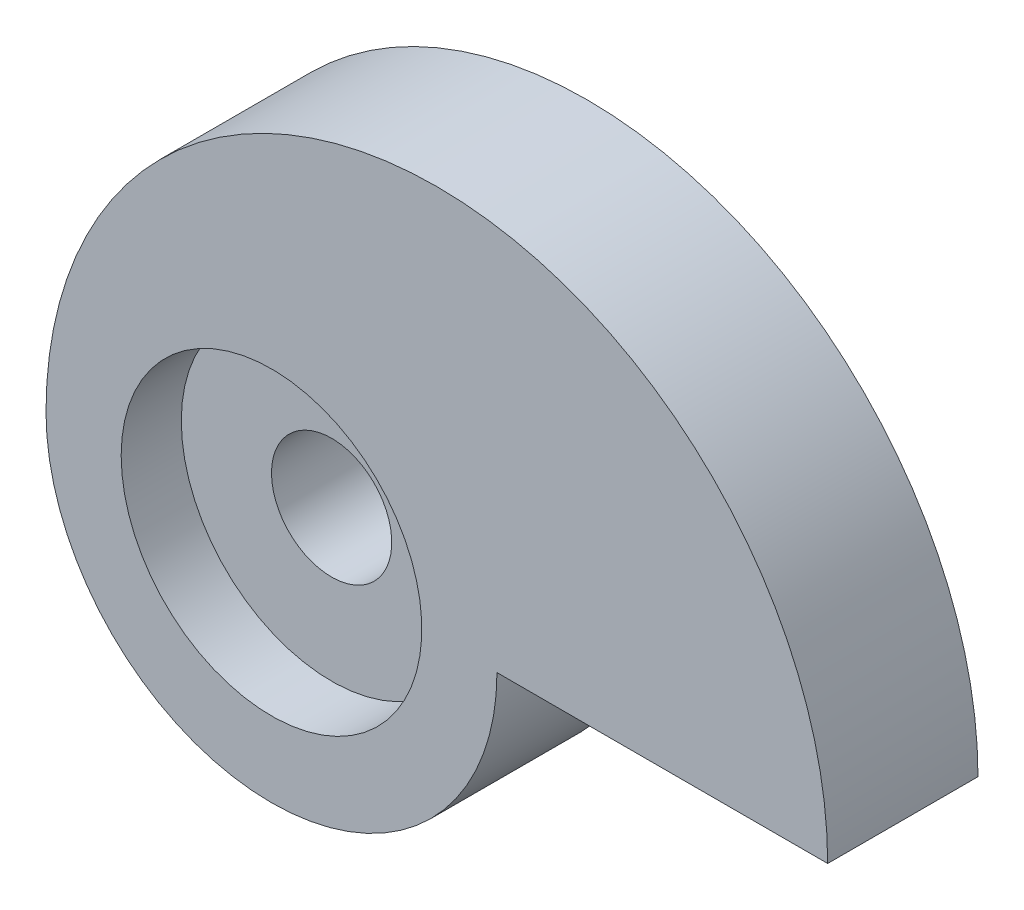
ISO-10303-21;
HEADER;
FILE_DESCRIPTION(('STEP AP214'),'2;1');
FILE_NAME('part.step','',(''),(''),'','','');
FILE_SCHEMA(('AUTOMOTIVE_DESIGN { 1 0 10303 214 1 1 1 1 }'));
ENDSEC;
DATA;
#1=APPLICATION_CONTEXT('core data for automotive mechanical design processes');
#2=APPLICATION_PROTOCOL_DEFINITION('international standard','automotive_design',2000,#1);
#3=PRODUCT_CONTEXT('',#1,'mechanical');
#4=PRODUCT('Part','Part','',(#3));
#5=PRODUCT_RELATED_PRODUCT_CATEGORY('part','',(#4));
#6=PRODUCT_DEFINITION_FORMATION('','',#4);
#7=PRODUCT_DEFINITION_CONTEXT('part definition',#1,'design');
#8=PRODUCT_DEFINITION('design','',#6,#7);
#9=PRODUCT_DEFINITION_SHAPE('','',#8);
#10=(LENGTH_UNIT() NAMED_UNIT(*) SI_UNIT(.MILLI.,.METRE.));
#11=(NAMED_UNIT(*) PLANE_ANGLE_UNIT() SI_UNIT($,.RADIAN.));
#12=(NAMED_UNIT(*) SI_UNIT($,.STERADIAN.) SOLID_ANGLE_UNIT());
#13=UNCERTAINTY_MEASURE_WITH_UNIT(LENGTH_MEASURE(1.E-05),#10,'distance_accuracy_value','');
#14=(GEOMETRIC_REPRESENTATION_CONTEXT(3) GLOBAL_UNCERTAINTY_ASSIGNED_CONTEXT((#13)) GLOBAL_UNIT_ASSIGNED_CONTEXT((#10,
#11,#12)) REPRESENTATION_CONTEXT('',''));
#15=CARTESIAN_POINT('',(0.,0.,0.));
#16=DIRECTION('',(0.,0.,1.));
#17=DIRECTION('',(1.,0.,0.));
#18=AXIS2_PLACEMENT_3D('',#15,#16,#17);
#19=CARTESIAN_POINT('',(-5.5,0.,-5.));
#20=DIRECTION('',(0.,0.,1.));
#21=DIRECTION('',(1.,0.,0.));
#22=AXIS2_PLACEMENT_3D('',#19,#20,#21);
#23=PLANE('',#22);
#24=CARTESIAN_POINT('',(-5.5,0.,-5.));
#25=DIRECTION('',(0.,0.,1.));
#26=DIRECTION('',(1.,0.,0.));
#27=AXIS2_PLACEMENT_3D('',#24,#25,#26);
#28=CIRCLE('',#27,5.);
#29=CARTESIAN_POINT('',(-10.3989794855664,-1.,-5.));
#30=VERTEX_POINT('',#29);
#31=CARTESIAN_POINT('',(-0.601020514433643,-1.,-5.));
#32=VERTEX_POINT('',#31);
#33=EDGE_CURVE('E407',#30,#32,#28,.T.);
#34=ORIENTED_EDGE('',*,*,#33,.F.);
#35=DIRECTION('',(1.,0.,0.));
#36=VECTOR('',#35,1.);
#37=CARTESIAN_POINT('',(-5.5,-1.,-5.));
#38=LINE('',#37,#36);
#39=CARTESIAN_POINT('',(-7.23205080756888,-1.,-5.));
#40=VERTEX_POINT('',#39);
#41=EDGE_CURVE('E443',#30,#40,#38,.T.);
#42=ORIENTED_EDGE('',*,*,#41,.T.);
#43=CARTESIAN_POINT('',(-5.5,0.,-5.));
#44=DIRECTION('',(0.,0.,1.));
#45=DIRECTION('',(1.,0.,0.));
#46=AXIS2_PLACEMENT_3D('',#43,#44,#45);
#47=CIRCLE('',#46,2.);
#48=CARTESIAN_POINT('',(-3.76794919243112,-1.,-5.));
#49=VERTEX_POINT('',#48);
#50=EDGE_CURVE('E408',#40,#49,#47,.T.);
#51=ORIENTED_EDGE('',*,*,#50,.T.);
#52=EDGE_CURVE('E440',#49,#32,#38,.T.);
#53=ORIENTED_EDGE('',*,*,#52,.T.);
#54=EDGE_LOOP('',(#34,#42,#51,#53));
#55=FACE_BOUND('',#54,.T.);
#56=ADVANCED_FACE('F286',(#55),#23,.F.);
#57=CARTESIAN_POINT('',(-5.5,0.,5.));
#58=DIRECTION('',(0.,0.,1.));
#59=DIRECTION('',(1.,0.,0.));
#60=AXIS2_PLACEMENT_3D('',#57,#58,#59);
#61=PLANE('',#60);
#62=CARTESIAN_POINT('',(-5.5,0.,5.));
#63=DIRECTION('',(0.,0.,-1.));
#64=DIRECTION('',(-1.,0.,0.));
#65=AXIS2_PLACEMENT_3D('',#62,#63,#64);
#66=CIRCLE('',#65,5.);
#67=CARTESIAN_POINT('',(-10.5,0.,5.));
#68=VERTEX_POINT('',#67);
#69=EDGE_CURVE('E594',#68,#68,#66,.T.);
#70=ORIENTED_EDGE('',*,*,#69,.T.);
#71=EDGE_LOOP('',(#70));
#72=FACE_BOUND('',#71,.T.);
#73=CARTESIAN_POINT('',(-5.5,0.,5.));
#74=DIRECTION('',(0.,0.,1.));
#75=DIRECTION('',(1.,0.,0.));
#76=AXIS2_PLACEMENT_3D('',#73,#74,#75);
#77=CIRCLE('',#76,7.5);
#78=CARTESIAN_POINT('',(-13.,0.,5.));
#79=VERTEX_POINT('',#78);
#80=CARTESIAN_POINT('',(2.,0.,5.));
#81=VERTEX_POINT('',#80);
#82=EDGE_CURVE('E419',#79,#81,#77,.T.);
#83=ORIENTED_EDGE('',*,*,#82,.T.);
#84=DIRECTION('',(1.,0.,0.));
#85=VECTOR('',#84,1.);
#86=CARTESIAN_POINT('',(2.,0.,5.));
#87=LINE('',#86,#85);
#88=CARTESIAN_POINT('',(13.,0.,5.));
#89=VERTEX_POINT('',#88);
#90=EDGE_CURVE('E422',#81,#89,#87,.T.);
#91=ORIENTED_EDGE('',*,*,#90,.T.);
#92=CARTESIAN_POINT('',(0.,0.,5.));
#93=DIRECTION('',(0.,0.,1.));
#94=DIRECTION('',(1.,0.,0.));
#95=AXIS2_PLACEMENT_3D('',#92,#93,#94);
#96=CIRCLE('',#95,13.);
#97=EDGE_CURVE('E425',#89,#79,#96,.T.);
#98=ORIENTED_EDGE('',*,*,#97,.T.);
#99=EDGE_LOOP('',(#83,#91,#98));
#100=FACE_BOUND('',#99,.T.);
#101=ADVANCED_FACE('F479',(#72,#100),#61,.T.);
#102=CARTESIAN_POINT('',(-5.5,0.,0.));
#103=DIRECTION('',(0.,0.,1.));
#104=DIRECTION('',(1.,0.,0.));
#105=AXIS2_PLACEMENT_3D('',#102,#103,#104);
#106=PLANE('',#105);
#107=CARTESIAN_POINT('',(-5.5,0.,0.));
#108=DIRECTION('',(0.,0.,1.));
#109=DIRECTION('',(1.,0.,0.));
#110=AXIS2_PLACEMENT_3D('',#107,#108,#109);
#111=CIRCLE('',#110,6.5);
#112=CARTESIAN_POINT('',(1.,0.,0.));
#113=VERTEX_POINT('',#112);
#114=EDGE_CURVE('E294',#113,#113,#111,.T.);
#115=ORIENTED_EDGE('',*,*,#114,.T.);
#116=EDGE_LOOP('',(#115));
#117=FACE_BOUND('',#116,.T.);
#118=CARTESIAN_POINT('',(-5.5,0.,0.));
#119=DIRECTION('',(0.,0.,1.));
#120=DIRECTION('',(1.,0.,0.));
#121=AXIS2_PLACEMENT_3D('',#118,#119,#120);
#122=CIRCLE('',#121,7.5);
#123=CARTESIAN_POINT('',(-13.,0.,0.));
#124=VERTEX_POINT('',#123);
#125=CARTESIAN_POINT('',(2.,0.,0.));
#126=VERTEX_POINT('',#125);
#127=EDGE_CURVE('E418',#124,#126,#122,.T.);
#128=ORIENTED_EDGE('',*,*,#127,.F.);
#129=CARTESIAN_POINT('',(0.,0.,0.));
#130=DIRECTION('',(0.,0.,1.));
#131=DIRECTION('',(1.,0.,0.));
#132=AXIS2_PLACEMENT_3D('',#129,#130,#131);
#133=CIRCLE('',#132,13.);
#134=CARTESIAN_POINT('',(13.,0.,0.));
#135=VERTEX_POINT('',#134);
#136=EDGE_CURVE('E423',#135,#124,#133,.T.);
#137=ORIENTED_EDGE('',*,*,#136,.F.);
#138=DIRECTION('',(1.,0.,0.));
#139=VECTOR('',#138,1.);
#140=CARTESIAN_POINT('',(2.,0.,0.));
#141=LINE('',#140,#139);
#142=EDGE_CURVE('E430',#126,#135,#141,.T.);
#143=ORIENTED_EDGE('',*,*,#142,.F.);
#144=EDGE_LOOP('',(#128,#137,#143));
#145=FACE_BOUND('',#144,.T.);
#146=ADVANCED_FACE('F540',(#117,#145),#106,.F.);
#147=CARTESIAN_POINT('',(-5.5,0.,5.));
#148=DIRECTION('',(0.,0.,-1.));
#149=DIRECTION('',(-1.,0.,0.));
#150=AXIS2_PLACEMENT_3D('',#147,#148,#149);
#151=CYLINDRICAL_SURFACE('',#150,7.5);
#152=ORIENTED_EDGE('',*,*,#127,.T.);
#153=DIRECTION('',(0.,0.,-1.));
#154=VECTOR('',#153,1.);
#155=CARTESIAN_POINT('',(2.,0.,5.));
#156=LINE('',#155,#154);
#157=EDGE_CURVE('E395',#81,#126,#156,.T.);
#158=ORIENTED_EDGE('',*,*,#157,.F.);
#159=ORIENTED_EDGE('',*,*,#82,.F.);
#160=DIRECTION('',(0.,0.,-1.));
#161=VECTOR('',#160,1.);
#162=CARTESIAN_POINT('',(-13.,0.,5.));
#163=LINE('',#162,#161);
#164=EDGE_CURVE('E427',#79,#124,#163,.T.);
#165=ORIENTED_EDGE('',*,*,#164,.T.);
#166=EDGE_LOOP('',(#152,#158,#159,#165));
#167=FACE_BOUND('',#166,.T.);
#168=ADVANCED_FACE('F612',(#167),#151,.T.);
#169=CARTESIAN_POINT('',(2.,0.,5.));
#170=DIRECTION('',(0.,1.,0.));
#171=DIRECTION('',(0.,0.,1.));
#172=AXIS2_PLACEMENT_3D('',#169,#170,#171);
#173=PLANE('',#172);
#174=ORIENTED_EDGE('',*,*,#142,.T.);
#175=DIRECTION('',(0.,0.,-1.));
#176=VECTOR('',#175,1.);
#177=CARTESIAN_POINT('',(13.,0.,5.));
#178=LINE('',#177,#176);
#179=EDGE_CURVE('E435',#89,#135,#178,.T.);
#180=ORIENTED_EDGE('',*,*,#179,.F.);
#181=ORIENTED_EDGE('',*,*,#90,.F.);
#182=ORIENTED_EDGE('',*,*,#157,.T.);
#183=EDGE_LOOP('',(#174,#180,#181,#182));
#184=FACE_BOUND('',#183,.T.);
#185=ADVANCED_FACE('F615',(#184),#173,.F.);
#186=CARTESIAN_POINT('',(0.,0.,5.));
#187=DIRECTION('',(0.,0.,-1.));
#188=DIRECTION('',(-1.,0.,0.));
#189=AXIS2_PLACEMENT_3D('',#186,#187,#188);
#190=CYLINDRICAL_SURFACE('',#189,13.);
#191=ORIENTED_EDGE('',*,*,#136,.T.);
#192=ORIENTED_EDGE('',*,*,#164,.F.);
#193=ORIENTED_EDGE('',*,*,#97,.F.);
#194=ORIENTED_EDGE('',*,*,#179,.T.);
#195=EDGE_LOOP('',(#191,#192,#193,#194));
#196=FACE_BOUND('',#195,.T.);
#197=ADVANCED_FACE('F475',(#196),#190,.T.);
#198=CARTESIAN_POINT('',(-5.5,0.,5.));
#199=DIRECTION('',(0.,0.,-1.));
#200=DIRECTION('',(-1.,0.,0.));
#201=AXIS2_PLACEMENT_3D('',#198,#199,#200);
#202=CYLINDRICAL_SURFACE('',#201,2.);
#203=CARTESIAN_POINT('',(-5.5,0.,3.));
#204=DIRECTION('',(0.,0.,-1.));
#205=DIRECTION('',(-1.,0.,0.));
#206=AXIS2_PLACEMENT_3D('',#203,#204,#205);
#207=CIRCLE('',#206,2.);
#208=CARTESIAN_POINT('',(-7.5,0.,3.));
#209=VERTEX_POINT('',#208);
#210=EDGE_CURVE('E534',#209,#209,#207,.T.);
#211=ORIENTED_EDGE('',*,*,#210,.F.);
#212=EDGE_LOOP('',(#211));
#213=FACE_BOUND('',#212,.T.);
#214=DIRECTION('',(0.,0.,-1.));
#215=VECTOR('',#214,1.);
#216=CARTESIAN_POINT('',(-7.23205080756888,-1.,5.));
#217=LINE('',#216,#215);
#218=CARTESIAN_POINT('',(-7.23205080756888,-1.,-3.));
#219=VERTEX_POINT('',#218);
#220=EDGE_CURVE('E414',#219,#40,#217,.T.);
#221=ORIENTED_EDGE('',*,*,#220,.F.);
#222=CARTESIAN_POINT('',(-7.23205080756888,-1.,-3.));
#223=CARTESIAN_POINT('',(-7.23204560573923,-1.00000195095149,-2.97380285641391));
#224=CARTESIAN_POINT('',(-7.2326458858948,-0.998969898721332,-2.94762059770534));
#225=CARTESIAN_POINT('',(-7.23500691100267,-0.994866625374567,-2.89548480130888));
#226=CARTESIAN_POINT('',(-7.23676694275608,-0.991796657482529,-2.86953113298121));
#227=CARTESIAN_POINT('',(-7.24368127709527,-0.979625521569913,-2.79260627254522));
#228=CARTESIAN_POINT('',(-7.25047118365239,-0.967562217088458,-2.74221712497417));
#229=CARTESIAN_POINT('',(-7.26748620757471,-0.936112076930328,-2.64457478379179));
#230=CARTESIAN_POINT('',(-7.27770440777793,-0.916739978258813,-2.59731550323605));
#231=CARTESIAN_POINT('',(-7.30040752413289,-0.871307839950419,-2.50664598928886));
#232=CARTESIAN_POINT('',(-7.31289603769649,-0.845237158617568,-2.46324202967145));
#233=CARTESIAN_POINT('',(-7.33996996559499,-0.78466357692548,-2.37768910292446));
#234=CARTESIAN_POINT('',(-7.35464333980743,-0.749645593111382,-2.33593276583788));
#235=CARTESIAN_POINT('',(-7.38372264002614,-0.673245759307682,-2.25858503946699));
#236=CARTESIAN_POINT('',(-7.39812848227474,-0.631861952761062,-2.22299555276055));
#237=CARTESIAN_POINT('',(-7.42622118410519,-0.540468641751175,-2.15661730434459));
#238=CARTESIAN_POINT('',(-7.43979253814581,-0.49006394619474,-2.12631956530011));
#239=CARTESIAN_POINT('',(-7.46351808066169,-0.384102077650395,-2.07483808826));
#240=CARTESIAN_POINT('',(-7.47367754829968,-0.328553035948645,-2.05364025583376));
#241=CARTESIAN_POINT('',(-7.48750807842346,-0.227502707957967,-2.02516217757423));
#242=CARTESIAN_POINT('',(-7.4921439649176,-0.182718319154595,-2.01577939701738));
#243=CARTESIAN_POINT('',(-7.49841285567472,-0.0919751083193857,-2.0031745104819));
#244=CARTESIAN_POINT('',(-7.50003827707627,-0.0460136154548431,-1.99996796059347));
#245=CARTESIAN_POINT('',(-7.5,0.,-2.));
#246=B_SPLINE_CURVE_WITH_KNOTS('',3,(#222,#223,#224,#225,#226,#227,#228,#229,#230,#231,#232,
#233,#234,#235,#236,#237,#238,#239,#240,#241,#242,#243,#244,#245),.UNSPECIFIED.,.F.,.F.,(4,2,2,
2,2,2,2,2,2,2,2,4),(0.,0.0785359204552875,0.157023589610273,0.312951876927789,0.46856742585974,
0.624431738505428,0.793037268766896,0.961694724432391,1.14182101966475,1.32166730997762,
1.45913325097171,1.59694497738737),.UNSPECIFIED.);
#247=CARTESIAN_POINT('',(-7.5,0.,-2.));
#248=VERTEX_POINT('',#247);
#249=EDGE_CURVE('E486',#219,#248,#246,.T.);
#250=ORIENTED_EDGE('',*,*,#249,.T.);
#251=CARTESIAN_POINT('',(-7.5,0.,-2.));
#252=CARTESIAN_POINT('',(-7.50000270001444,0.026406025225628,-1.99999859692792));
#253=CARTESIAN_POINT('',(-7.49947646417091,0.0527980136949361,-2.00104663431609));
#254=CARTESIAN_POINT('',(-7.49739531857115,0.105366311265512,-2.00521716287123));
#255=CARTESIAN_POINT('',(-7.49584082204084,0.131542702731886,-2.00833882071687));
#256=CARTESIAN_POINT('',(-7.48970044136635,0.209215974974574,-2.02073369494834));
#257=CARTESIAN_POINT('',(-7.48363700497133,0.260148469940141,-2.0330374412745));
#258=CARTESIAN_POINT('',(-7.46816731079717,0.358917466881668,-2.06518513879199));
#259=CARTESIAN_POINT('',(-7.45876478870542,0.406757358371933,-2.08502066532185));
#260=CARTESIAN_POINT('',(-7.43747068148192,0.498421727903021,-2.13154141113257));
#261=CARTESIAN_POINT('',(-7.42557658512388,0.5422420901472,-2.15823354729241));
#262=CARTESIAN_POINT('',(-7.39956294700834,0.627507636466253,-2.21951645733809));
#263=CARTESIAN_POINT('',(-7.38535278220365,0.668653367046101,-2.25448455863881));
#264=CARTESIAN_POINT('',(-7.35660030766928,0.744777592319192,-2.3305197075124));
#265=CARTESIAN_POINT('',(-7.34205773926212,0.779751085456756,-2.37159165202963));
#266=CARTESIAN_POINT('',(-7.31297902171833,0.845276230561724,-2.46251644312768));
#267=CARTESIAN_POINT('',(-7.29853253759958,0.875267218548396,-2.51280503036786));
#268=CARTESIAN_POINT('',(-7.27284187626178,0.926200179305586,-2.61845147831261));
#269=CARTESIAN_POINT('',(-7.26159085728834,0.947161535789092,-2.67379816793758));
#270=CARTESIAN_POINT('',(-7.2461767744272,0.97522726996317,-2.77427050838128));
#271=CARTESIAN_POINT('',(-7.24095909763356,0.984453466376408,-2.81864596282671));
#272=CARTESIAN_POINT('',(-7.23385952558355,0.99686812992437,-2.90865475887692));
#273=CARTESIAN_POINT('',(-7.23199004977433,1.00003412097476,-2.95429214871369));
#274=CARTESIAN_POINT('',(-7.23205080756888,1.,-3.));
#275=B_SPLINE_CURVE_WITH_KNOTS('',3,(#251,#252,#253,#254,#255,#256,#257,#258,#259,#260,#261,
#262,#263,#264,#265,#266,#267,#268,#269,#270,#271,#272,#273,#274),.UNSPECIFIED.,.F.,.F.,(4,2,2,
2,2,2,2,2,2,2,2,4),(0.,0.0791649034650184,0.158298012334672,0.315701755856429,0.472929951841001,
0.630317385234155,0.797131343834443,0.964079862432026,1.14410070601832,1.32373315332476,
1.4600864569716,1.59694449515729),.UNSPECIFIED.);
#276=CARTESIAN_POINT('',(-7.23205080756888,1.,-3.));
#277=VERTEX_POINT('',#276);
#278=EDGE_CURVE('E402',#248,#277,#275,.T.);
#279=ORIENTED_EDGE('',*,*,#278,.T.);
#280=DIRECTION('',(0.,0.,-1.));
#281=VECTOR('',#280,1.);
#282=CARTESIAN_POINT('',(-7.23205080756888,1.,5.));
#283=LINE('',#282,#281);
#284=CARTESIAN_POINT('',(-7.23205080756888,1.,-5.));
#285=VERTEX_POINT('',#284);
#286=EDGE_CURVE('E386',#285,#277,#283,.F.);
#287=ORIENTED_EDGE('',*,*,#286,.F.);
#288=CARTESIAN_POINT('',(-3.76794919243112,1.,-5.));
#289=VERTEX_POINT('',#288);
#290=EDGE_CURVE('E400',#289,#285,#47,.T.);
#291=ORIENTED_EDGE('',*,*,#290,.F.);
#292=DIRECTION('',(0.,0.,-1.));
#293=VECTOR('',#292,1.);
#294=CARTESIAN_POINT('',(-3.76794919243112,1.,5.));
#295=LINE('',#294,#293);
#296=CARTESIAN_POINT('',(-3.76794919243112,1.,-3.));
#297=VERTEX_POINT('',#296);
#298=EDGE_CURVE('E403',#297,#289,#295,.T.);
#299=ORIENTED_EDGE('',*,*,#298,.F.);
#300=CARTESIAN_POINT('',(-3.76794919243112,1.,-3.));
#301=CARTESIAN_POINT('',(-3.76795439426077,1.00000195095149,-2.97380285641391));
#302=CARTESIAN_POINT('',(-3.7673541141052,0.998969898721333,-2.94762059770534));
#303=CARTESIAN_POINT('',(-3.76499308899733,0.994866625374568,-2.89548480130888));
#304=CARTESIAN_POINT('',(-3.76323305724392,0.991796657482529,-2.86953113298121));
#305=CARTESIAN_POINT('',(-3.75631872290473,0.979625521569914,-2.79260627254522));
#306=CARTESIAN_POINT('',(-3.74952881634761,0.967562217088458,-2.74221712497417));
#307=CARTESIAN_POINT('',(-3.73251379242529,0.936112076930329,-2.64457478379179));
#308=CARTESIAN_POINT('',(-3.72229559222207,0.916739978258813,-2.59731550323605));
#309=CARTESIAN_POINT('',(-3.69959247586711,0.871307839950419,-2.50664598928886));
#310=CARTESIAN_POINT('',(-3.68710396230351,0.845237158617568,-2.46324202967145));
#311=CARTESIAN_POINT('',(-3.66003003440501,0.78466357692548,-2.37768910292446));
#312=CARTESIAN_POINT('',(-3.64535666019257,0.749645593111382,-2.33593276583788));
#313=CARTESIAN_POINT('',(-3.61627735997386,0.673245759307683,-2.25858503946699));
#314=CARTESIAN_POINT('',(-3.60187151772526,0.631861952761062,-2.22299555276055));
#315=CARTESIAN_POINT('',(-3.57377881589481,0.540468641751176,-2.15661730434459));
#316=CARTESIAN_POINT('',(-3.56020746185418,0.49006394619474,-2.12631956530011));
#317=CARTESIAN_POINT('',(-3.53648191933831,0.384102077650396,-2.07483808826));
#318=CARTESIAN_POINT('',(-3.52632245170032,0.328553035948646,-2.05364025583376));
#319=CARTESIAN_POINT('',(-3.51249192157654,0.227502707957968,-2.02516217757423));
#320=CARTESIAN_POINT('',(-3.5078560350824,0.182718319154596,-2.01577939701738));
#321=CARTESIAN_POINT('',(-3.50158714432528,0.0919751083193864,-2.0031745104819));
#322=CARTESIAN_POINT('',(-3.49996172292373,0.0460136154548437,-1.99996796059347));
#323=CARTESIAN_POINT('',(-3.5,0.,-2.));
#324=B_SPLINE_CURVE_WITH_KNOTS('',3,(#300,#301,#302,#303,#304,#305,#306,#307,#308,#309,#310,
#311,#312,#313,#314,#315,#316,#317,#318,#319,#320,#321,#322,#323),.UNSPECIFIED.,.F.,.F.,(4,2,2,
2,2,2,2,2,2,2,2,4),(0.,0.0785359204552875,0.157023589610273,0.312951876927789,0.46856742585974,
0.624431738505428,0.793037268766896,0.96169472443239,1.14182101966475,1.32166730997762,
1.45913325097171,1.59694497738737),.UNSPECIFIED.);
#325=CARTESIAN_POINT('',(-3.5,0.,-2.));
#326=VERTEX_POINT('',#325);
#327=EDGE_CURVE('E309',#297,#326,#324,.T.);
#328=ORIENTED_EDGE('',*,*,#327,.T.);
#329=CARTESIAN_POINT('',(-3.5,0.,-2.));
#330=CARTESIAN_POINT('',(-3.49999729998556,-0.0264060252256275,-1.99999859692792));
#331=CARTESIAN_POINT('',(-3.50052353582909,-0.0527980136949356,-2.00104663431609));
#332=CARTESIAN_POINT('',(-3.50260468142885,-0.105366311265511,-2.00521716287123));
#333=CARTESIAN_POINT('',(-3.50415917795916,-0.131542702731885,-2.00833882071687));
#334=CARTESIAN_POINT('',(-3.51029955863365,-0.209215974974574,-2.02073369494834));
#335=CARTESIAN_POINT('',(-3.51636299502867,-0.260148469940141,-2.0330374412745));
#336=CARTESIAN_POINT('',(-3.53183268920283,-0.358917466881667,-2.06518513879199));
#337=CARTESIAN_POINT('',(-3.54123521129458,-0.406757358371933,-2.08502066532185));
#338=CARTESIAN_POINT('',(-3.56252931851808,-0.49842172790302,-2.13154141113257));
#339=CARTESIAN_POINT('',(-3.57442341487612,-0.542242090147199,-2.15823354729241));
#340=CARTESIAN_POINT('',(-3.60043705299166,-0.627507636466253,-2.21951645733809));
#341=CARTESIAN_POINT('',(-3.61464721779635,-0.668653367046101,-2.2544845586388));
#342=CARTESIAN_POINT('',(-3.64339969233072,-0.744777592319192,-2.3305197075124));
#343=CARTESIAN_POINT('',(-3.65794226073788,-0.779751085456756,-2.37159165202963));
#344=CARTESIAN_POINT('',(-3.68702097828167,-0.845276230561723,-2.46251644312768));
#345=CARTESIAN_POINT('',(-3.70146746240042,-0.875267218548396,-2.51280503036786));
#346=CARTESIAN_POINT('',(-3.72715812373822,-0.926200179305586,-2.61845147831261));
#347=CARTESIAN_POINT('',(-3.73840914271166,-0.947161535789092,-2.67379816793758));
#348=CARTESIAN_POINT('',(-3.7538232255728,-0.975227269963169,-2.77427050838128));
#349=CARTESIAN_POINT('',(-3.75904090236644,-0.984453466376408,-2.81864596282671));
#350=CARTESIAN_POINT('',(-3.76614047441645,-0.99686812992437,-2.90865475887692));
#351=CARTESIAN_POINT('',(-3.76800995022567,-1.00003412097476,-2.95429214871369));
#352=CARTESIAN_POINT('',(-3.76794919243112,-1.,-3.));
#353=B_SPLINE_CURVE_WITH_KNOTS('',3,(#329,#330,#331,#332,#333,#334,#335,#336,#337,#338,#339,
#340,#341,#342,#343,#344,#345,#346,#347,#348,#349,#350,#351,#352),.UNSPECIFIED.,.F.,.F.,(4,2,2,
2,2,2,2,2,2,2,2,4),(0.,0.0791649034650183,0.158298012334672,0.315701755856429,0.472929951841001,
0.630317385234155,0.797131343834442,0.964079862432026,1.14410070601832,1.32373315332476,
1.4600864569716,1.59694449515729),.UNSPECIFIED.);
#354=CARTESIAN_POINT('',(-3.76794919243112,-1.,-3.));
#355=VERTEX_POINT('',#354);
#356=EDGE_CURVE('E492',#326,#355,#353,.T.);
#357=ORIENTED_EDGE('',*,*,#356,.T.);
#358=DIRECTION('',(0.,0.,-1.));
#359=VECTOR('',#358,1.);
#360=CARTESIAN_POINT('',(-3.76794919243112,-1.,5.));
#361=LINE('',#360,#359);
#362=EDGE_CURVE('E585',#49,#355,#361,.F.);
#363=ORIENTED_EDGE('',*,*,#362,.F.);
#364=ORIENTED_EDGE('',*,*,#50,.F.);
#365=EDGE_LOOP('',(#221,#250,#279,#287,#291,#299,#328,#357,#363,#364));
#366=FACE_BOUND('',#365,.T.);
#367=ADVANCED_FACE('F399',(#213,#366),#202,.F.);
#368=CARTESIAN_POINT('',(-5.5,0.,-5.));
#369=DIRECTION('',(0.,0.,1.));
#370=DIRECTION('',(1.,0.,0.));
#371=AXIS2_PLACEMENT_3D('',#368,#369,#370);
#372=CYLINDRICAL_SURFACE('',#371,5.);
#373=CARTESIAN_POINT('',(-5.5,0.,-1.5));
#374=DIRECTION('',(0.,0.,1.));
#375=DIRECTION('',(1.,0.,0.));
#376=AXIS2_PLACEMENT_3D('',#373,#374,#375);
#377=CIRCLE('',#376,5.);
#378=CARTESIAN_POINT('',(-0.5,0.,-1.5));
#379=VERTEX_POINT('',#378);
#380=EDGE_CURVE('E12',#379,#379,#377,.F.);
#381=ORIENTED_EDGE('',*,*,#380,.T.);
#382=EDGE_LOOP('',(#381));
#383=FACE_BOUND('',#382,.T.);
#384=DIRECTION('',(0.,0.,1.));
#385=VECTOR('',#384,1.);
#386=CARTESIAN_POINT('',(-10.3989794855664,-1.,-5.));
#387=LINE('',#386,#385);
#388=CARTESIAN_POINT('',(-10.3989794855664,-1.,-3.));
#389=VERTEX_POINT('',#388);
#390=EDGE_CURVE('E574',#30,#389,#387,.T.);
#391=ORIENTED_EDGE('',*,*,#390,.F.);
#392=ORIENTED_EDGE('',*,*,#33,.T.);
#393=DIRECTION('',(0.,0.,1.));
#394=VECTOR('',#393,1.);
#395=CARTESIAN_POINT('',(-0.601020514433643,-1.,-5.));
#396=LINE('',#395,#394);
#397=CARTESIAN_POINT('',(-0.601020514433643,-1.,-3.));
#398=VERTEX_POINT('',#397);
#399=EDGE_CURVE('E578',#398,#32,#396,.F.);
#400=ORIENTED_EDGE('',*,*,#399,.F.);
#401=CARTESIAN_POINT('',(-0.601020514433643,-1.,-3.));
#402=CARTESIAN_POINT('',(-0.60102194455821,-1.00000014836578,-2.97216558893099));
#403=CARTESIAN_POINT('',(-0.600782993348623,-0.998837131416079,-2.94434479554441));
#404=CARTESIAN_POINT('',(-0.599839237913602,-0.994199583584453,-2.88890793309298));
#405=CARTESIAN_POINT('',(-0.599134491365518,-0.990725338891152,-2.86129183910918));
#406=CARTESIAN_POINT('',(-0.596348417423546,-0.976880363734725,-2.77914178752135));
#407=CARTESIAN_POINT('',(-0.593595110456425,-0.963087220158088,-2.72516698316988));
#408=CARTESIAN_POINT('',(-0.586611744859595,-0.92679706054986,-2.62035810758658));
#409=CARTESIAN_POINT('',(-0.582381498317061,-0.904298936933603,-2.56952443697413));
#410=CARTESIAN_POINT('',(-0.572922937759702,-0.851254893913792,-2.47233635252998));
#411=CARTESIAN_POINT('',(-0.567694493713934,-0.820707925824222,-2.42598252345441));
#412=CARTESIAN_POINT('',(-0.556747343853065,-0.751981199378612,-2.3384409254263));
#413=CARTESIAN_POINT('',(-0.551023315516744,-0.713710590192284,-2.29732517205145));
#414=CARTESIAN_POINT('',(-0.539775922478964,-0.630811726059916,-2.22204667037239));
#415=CARTESIAN_POINT('',(-0.53425259585577,-0.586182272500587,-2.18788523588094));
#416=CARTESIAN_POINT('',(-0.523970498222607,-0.4913482798135,-2.12720284544762));
#417=CARTESIAN_POINT('',(-0.519219024322634,-0.441097352759901,-2.10075312198071));
#418=CARTESIAN_POINT('',(-0.511080411301849,-0.336765539043574,-2.05671347858426));
#419=CARTESIAN_POINT('',(-0.50769231535716,-0.282687369805478,-2.03911734299373));
#420=CARTESIAN_POINT('',(-0.503481548177378,-0.19025286643945,-2.01751852262519));
#421=CARTESIAN_POINT('',(-0.502183030839093,-0.152496309690071,-2.01095685074478));
#422=CARTESIAN_POINT('',(-0.50043926303991,-0.0764992606637669,-2.00219614352281));
#423=CARTESIAN_POINT('',(-0.499993171401945,-0.0382592829881766,-1.99999280728272));
#424=CARTESIAN_POINT('',(-0.5,0.,-2.));
#425=B_SPLINE_CURVE_WITH_KNOTS('',3,(#401,#402,#403,#404,#405,#406,#407,#408,#409,#410,#411,
#412,#413,#414,#415,#416,#417,#418,#419,#420,#421,#422,#423,#424),.UNSPECIFIED.,.F.,.F.,(4,2,2,
2,2,2,2,2,2,2,2,4),(0.,0.0834510357935889,0.166891740154894,0.333361313986124,0.499852075667349,
0.66636454020823,0.834963596749809,1.0035944755952,1.17373692570498,1.34375976006433,
1.45854822188818,1.57322335138711),.UNSPECIFIED.);
#426=CARTESIAN_POINT('',(-0.5,0.,-2.));
#427=VERTEX_POINT('',#426);
#428=EDGE_CURVE('E301',#398,#427,#425,.T.);
#429=ORIENTED_EDGE('',*,*,#428,.T.);
#430=CARTESIAN_POINT('',(-0.5,0.,-2.));
#431=CARTESIAN_POINT('',(-0.499998713395576,0.0278400559819601,-1.99999986685743));
#432=CARTESIAN_POINT('',(-0.500232809297192,0.0556665127872034,-2.00116334134438));
#433=CARTESIAN_POINT('',(-0.501158091415902,0.111115021274996,-2.00580281053696));
#434=CARTESIAN_POINT('',(-0.501849223425341,0.138737096805753,-2.00927853099445));
#435=CARTESIAN_POINT('',(-0.504583302730289,0.220907211360357,-2.02312989891793));
#436=CARTESIAN_POINT('',(-0.507287065296225,0.274896511064148,-2.03692992144869));
#437=CARTESIAN_POINT('',(-0.514163072925682,0.379735185905215,-2.07324010131588));
#438=CARTESIAN_POINT('',(-0.518335539106208,0.430584086891884,-2.09575157023312));
#439=CARTESIAN_POINT('',(-0.527695147580145,0.527797322603325,-2.14882680697004));
#440=CARTESIAN_POINT('',(-0.532882406708259,0.574161140033953,-2.17939150211096));
#441=CARTESIAN_POINT('',(-0.543777995860352,0.661691440289518,-2.24813628602935));
#442=CARTESIAN_POINT('',(-0.5494918246106,0.7027889925794,-2.28640323399989));
#443=CARTESIAN_POINT('',(-0.560757519233082,0.778032388532745,-2.36928726400204));
#444=CARTESIAN_POINT('',(-0.566309352220618,0.8121768290293,-2.41390562469462));
#445=CARTESIAN_POINT('',(-0.57667715680046,0.872841030294658,-2.50872948765732));
#446=CARTESIAN_POINT('',(-0.581485765717138,0.899286544676468,-2.55898331216412));
#447=CARTESIAN_POINT('',(-0.589739608327866,0.943317413695171,-2.66332095094163));
#448=CARTESIAN_POINT('',(-0.593185817741398,0.960909111708465,-2.71740199140063));
#449=CARTESIAN_POINT('',(-0.597471939891443,0.982495741592614,-2.80982433124855));
#450=CARTESIAN_POINT('',(-0.598794966681857,0.989051933382981,-2.84756483112178));
#451=CARTESIAN_POINT('',(-0.600572539938079,0.997805574784862,-2.92353073972127));
#452=CARTESIAN_POINT('',(-0.601027922649335,1.00000722143563,-2.96175564575593));
#453=CARTESIAN_POINT('',(-0.601020514433643,1.,-3.));
#454=B_SPLINE_CURVE_WITH_KNOTS('',3,(#430,#431,#432,#433,#434,#435,#436,#437,#438,#439,#440,
#441,#442,#443,#444,#445,#446,#447,#448,#449,#450,#451,#452,#453),.UNSPECIFIED.,.F.,.F.,(4,2,2,
2,2,2,2,2,2,2,2,4),(0.,0.0834680218667803,0.166926145622065,0.333435600212169,0.499970133946967,
0.666523852359724,0.835073209406838,1.00365654678176,1.17381553934047,1.34385244617614,
1.45859316967227,1.57322324867281),.UNSPECIFIED.);
#455=CARTESIAN_POINT('',(-0.601020514433643,1.,-3.));
#456=VERTEX_POINT('',#455);
#457=EDGE_CURVE('E517',#427,#456,#454,.T.);
#458=ORIENTED_EDGE('',*,*,#457,.T.);
#459=DIRECTION('',(0.,0.,1.));
#460=VECTOR('',#459,1.);
#461=CARTESIAN_POINT('',(-0.601020514433643,1.,-5.));
#462=LINE('',#461,#460);
#463=CARTESIAN_POINT('',(-0.601020514433643,1.,-5.));
#464=VERTEX_POINT('',#463);
#465=EDGE_CURVE('E530',#464,#456,#462,.T.);
#466=ORIENTED_EDGE('',*,*,#465,.F.);
#467=CARTESIAN_POINT('',(-10.3989794855664,1.,-5.));
#468=VERTEX_POINT('',#467);
#469=EDGE_CURVE('E411',#464,#468,#28,.T.);
#470=ORIENTED_EDGE('',*,*,#469,.T.);
#471=DIRECTION('',(0.,0.,1.));
#472=VECTOR('',#471,1.);
#473=CARTESIAN_POINT('',(-10.3989794855664,1.,-5.));
#474=LINE('',#473,#472);
#475=CARTESIAN_POINT('',(-10.3989794855664,1.,-3.));
#476=VERTEX_POINT('',#475);
#477=EDGE_CURVE('E389',#476,#468,#474,.F.);
#478=ORIENTED_EDGE('',*,*,#477,.F.);
#479=CARTESIAN_POINT('',(-10.3989794855664,1.,-3.));
#480=CARTESIAN_POINT('',(-10.3989780554418,1.00000014836578,-2.97216558893099));
#481=CARTESIAN_POINT('',(-10.3992170066514,0.998837131416079,-2.94434479554441));
#482=CARTESIAN_POINT('',(-10.4001607620864,0.994199583584453,-2.88890793309298));
#483=CARTESIAN_POINT('',(-10.4008655086345,0.990725338891152,-2.86129183910918));
#484=CARTESIAN_POINT('',(-10.4036515825765,0.976880363734726,-2.77914178752135));
#485=CARTESIAN_POINT('',(-10.4064048895436,0.963087220158089,-2.72516698316988));
#486=CARTESIAN_POINT('',(-10.4133882551404,0.926797060549861,-2.62035810758658));
#487=CARTESIAN_POINT('',(-10.4176185016829,0.904298936933603,-2.56952443697413));
#488=CARTESIAN_POINT('',(-10.4270770622403,0.851254893913793,-2.47233635252998));
#489=CARTESIAN_POINT('',(-10.4323055062861,0.820707925824222,-2.42598252345441));
#490=CARTESIAN_POINT('',(-10.4432526561469,0.751981199378612,-2.3384409254263));
#491=CARTESIAN_POINT('',(-10.4489766844833,0.713710590192285,-2.29732517205145));
#492=CARTESIAN_POINT('',(-10.460224077521,0.630811726059916,-2.22204667037238));
#493=CARTESIAN_POINT('',(-10.4657474041442,0.586182272500587,-2.18788523588094));
#494=CARTESIAN_POINT('',(-10.4760295017774,0.491348279813501,-2.12720284544762));
#495=CARTESIAN_POINT('',(-10.4807809756774,0.441097352759901,-2.10075312198071));
#496=CARTESIAN_POINT('',(-10.4889195886982,0.336765539043574,-2.05671347858426));
#497=CARTESIAN_POINT('',(-10.4923076846428,0.282687369805478,-2.03911734299373));
#498=CARTESIAN_POINT('',(-10.4965184518226,0.190252866439451,-2.01751852262519));
#499=CARTESIAN_POINT('',(-10.4978169691609,0.152496309690071,-2.01095685074478));
#500=CARTESIAN_POINT('',(-10.4995607369601,0.0764992606637672,-2.00219614352281));
#501=CARTESIAN_POINT('',(-10.5000068285981,0.0382592829881769,-1.99999280728272));
#502=CARTESIAN_POINT('',(-10.5,0.,-2.));
#503=B_SPLINE_CURVE_WITH_KNOTS('',3,(#479,#480,#481,#482,#483,#484,#485,#486,#487,#488,#489,
#490,#491,#492,#493,#494,#495,#496,#497,#498,#499,#500,#501,#502),.UNSPECIFIED.,.F.,.F.,(4,2,2,
2,2,2,2,2,2,2,2,4),(0.,0.0834510357935902,0.166891740154895,0.333361313986124,0.499852075667348,
0.66636454020823,0.834963596749809,1.0035944755952,1.17373692570498,1.34375976006433,
1.45854822188818,1.57322335138711),.UNSPECIFIED.);
#504=CARTESIAN_POINT('',(-10.5,0.,-2.));
#505=VERTEX_POINT('',#504);
#506=EDGE_CURVE('E460',#476,#505,#503,.T.);
#507=ORIENTED_EDGE('',*,*,#506,.T.);
#508=CARTESIAN_POINT('',(-10.5,0.,-2.));
#509=CARTESIAN_POINT('',(-10.5000012866044,-0.0278400559819597,-1.99999986685743));
#510=CARTESIAN_POINT('',(-10.4997671907028,-0.0556665127872029,-2.00116334134438));
#511=CARTESIAN_POINT('',(-10.4988419085841,-0.111115021274996,-2.00580281053696));
#512=CARTESIAN_POINT('',(-10.4981507765747,-0.138737096805753,-2.00927853099445));
#513=CARTESIAN_POINT('',(-10.4954166972697,-0.220907211360356,-2.02312989891793));
#514=CARTESIAN_POINT('',(-10.4927129347038,-0.274896511064148,-2.03692992144869));
#515=CARTESIAN_POINT('',(-10.4858369270743,-0.379735185905214,-2.07324010131588));
#516=CARTESIAN_POINT('',(-10.4816644608938,-0.430584086891884,-2.09575157023312));
#517=CARTESIAN_POINT('',(-10.4723048524199,-0.527797322603324,-2.14882680697004));
#518=CARTESIAN_POINT('',(-10.4671175932917,-0.574161140033953,-2.17939150211096));
#519=CARTESIAN_POINT('',(-10.4562220041396,-0.661691440289518,-2.24813628602935));
#520=CARTESIAN_POINT('',(-10.4505081753894,-0.7027889925794,-2.28640323399989));
#521=CARTESIAN_POINT('',(-10.4392424807669,-0.778032388532745,-2.36928726400204));
#522=CARTESIAN_POINT('',(-10.4336906477794,-0.812176829029299,-2.41390562469462));
#523=CARTESIAN_POINT('',(-10.4233228431995,-0.872841030294657,-2.50872948765732));
#524=CARTESIAN_POINT('',(-10.4185142342829,-0.899286544676467,-2.55898331216412));
#525=CARTESIAN_POINT('',(-10.4102603916721,-0.943317413695171,-2.66332095094163));
#526=CARTESIAN_POINT('',(-10.4068141822586,-0.960909111708464,-2.71740199140063));
#527=CARTESIAN_POINT('',(-10.4025280601086,-0.982495741592613,-2.80982433124855));
#528=CARTESIAN_POINT('',(-10.4012050333181,-0.989051933382981,-2.84756483112178));
#529=CARTESIAN_POINT('',(-10.3994274600619,-0.997805574784862,-2.92353073972127));
#530=CARTESIAN_POINT('',(-10.3989720773507,-1.00000722143563,-2.96175564575593));
#531=CARTESIAN_POINT('',(-10.3989794855664,-1.,-3.));
#532=B_SPLINE_CURVE_WITH_KNOTS('',3,(#508,#509,#510,#511,#512,#513,#514,#515,#516,#517,#518,
#519,#520,#521,#522,#523,#524,#525,#526,#527,#528,#529,#530,#531),.UNSPECIFIED.,.F.,.F.,(4,2,2,
2,2,2,2,2,2,2,2,4),(0.,0.0834680218667803,0.166926145622065,0.333435600212169,0.499970133946967,
0.666523852359724,0.835073209406837,1.00365654678176,1.17381553934047,1.34385244617614,
1.45859316967227,1.57322324867281),.UNSPECIFIED.);
#533=EDGE_CURVE('E576',#505,#389,#532,.T.);
#534=ORIENTED_EDGE('',*,*,#533,.T.);
#535=EDGE_LOOP('',(#391,#392,#400,#429,#458,#466,#470,#478,#507,#534));
#536=FACE_BOUND('',#535,.T.);
#537=ADVANCED_FACE('F474',(#383,#536),#372,.T.);
#538=ORIENTED_EDGE('',*,*,#469,.F.);
#539=DIRECTION('',(-1.,0.,0.));
#540=VECTOR('',#539,1.);
#541=CARTESIAN_POINT('',(-5.5,1.,-5.));
#542=LINE('',#541,#540);
#543=EDGE_CURVE('E394',#464,#289,#542,.T.);
#544=ORIENTED_EDGE('',*,*,#543,.T.);
#545=ORIENTED_EDGE('',*,*,#290,.T.);
#546=EDGE_CURVE('E382',#285,#468,#542,.T.);
#547=ORIENTED_EDGE('',*,*,#546,.T.);
#548=EDGE_LOOP('',(#538,#544,#545,#547));
#549=FACE_BOUND('',#548,.T.);
#550=ADVANCED_FACE('F406',(#549),#23,.F.);
#551=CARTESIAN_POINT('',(1.00142571791383,-1.,-2.));
#552=DIRECTION('',(0.,-1.,0.));
#553=DIRECTION('',(0.,0.,-1.));
#554=AXIS2_PLACEMENT_3D('',#551,#552,#553);
#555=PLANE('',#554);
#556=ORIENTED_EDGE('',*,*,#390,.T.);
#557=DIRECTION('',(-1.,0.,0.));
#558=VECTOR('',#557,1.);
#559=CARTESIAN_POINT('',(-7.23205080756888,-1.,-3.));
#560=LINE('',#559,#558);
#561=EDGE_CURVE('E446',#389,#219,#560,.F.);
#562=ORIENTED_EDGE('',*,*,#561,.T.);
#563=ORIENTED_EDGE('',*,*,#220,.T.);
#564=ORIENTED_EDGE('',*,*,#41,.F.);
#565=EDGE_LOOP('',(#556,#562,#563,#564));
#566=FACE_BOUND('',#565,.T.);
#567=ADVANCED_FACE('F561',(#566),#555,.F.);
#568=CARTESIAN_POINT('',(1.00142571791383,1.,-2.));
#569=DIRECTION('',(0.,1.,0.));
#570=DIRECTION('',(0.,0.,1.));
#571=AXIS2_PLACEMENT_3D('',#568,#569,#570);
#572=PLANE('',#571);
#573=ORIENTED_EDGE('',*,*,#286,.T.);
#574=DIRECTION('',(1.,0.,0.));
#575=VECTOR('',#574,1.);
#576=CARTESIAN_POINT('',(-10.3989794855664,1.,-3.));
#577=LINE('',#576,#575);
#578=EDGE_CURVE('E444',#277,#476,#577,.F.);
#579=ORIENTED_EDGE('',*,*,#578,.T.);
#580=ORIENTED_EDGE('',*,*,#477,.T.);
#581=ORIENTED_EDGE('',*,*,#546,.F.);
#582=EDGE_LOOP('',(#573,#579,#580,#581));
#583=FACE_BOUND('',#582,.T.);
#584=ADVANCED_FACE('F384',(#583),#572,.F.);
#585=ORIENTED_EDGE('',*,*,#465,.T.);
#586=DIRECTION('',(1.,0.,0.));
#587=VECTOR('',#586,1.);
#588=CARTESIAN_POINT('',(-3.76794919243112,1.,-3.));
#589=LINE('',#588,#587);
#590=EDGE_CURVE('E451',#456,#297,#589,.F.);
#591=ORIENTED_EDGE('',*,*,#590,.T.);
#592=ORIENTED_EDGE('',*,*,#298,.T.);
#593=ORIENTED_EDGE('',*,*,#543,.F.);
#594=EDGE_LOOP('',(#585,#591,#592,#593));
#595=FACE_BOUND('',#594,.T.);
#596=ADVANCED_FACE('F666',(#595),#572,.F.);
#597=ORIENTED_EDGE('',*,*,#362,.T.);
#598=DIRECTION('',(-1.,0.,0.));
#599=VECTOR('',#598,1.);
#600=CARTESIAN_POINT('',(-0.601020514433643,-1.,-3.));
#601=LINE('',#600,#599);
#602=EDGE_CURVE('E448',#355,#398,#601,.F.);
#603=ORIENTED_EDGE('',*,*,#602,.T.);
#604=ORIENTED_EDGE('',*,*,#399,.T.);
#605=ORIENTED_EDGE('',*,*,#52,.F.);
#606=EDGE_LOOP('',(#597,#603,#604,#605));
#607=FACE_BOUND('',#606,.T.);
#608=ADVANCED_FACE('F568',(#607),#555,.F.);
#609=CARTESIAN_POINT('',(0.,0.,-3.));
#610=DIRECTION('',(1.,0.,0.));
#611=DIRECTION('',(0.,0.,-1.));
#612=AXIS2_PLACEMENT_3D('',#609,#610,#611);
#613=CYLINDRICAL_SURFACE('',#612,1.);
#614=ORIENTED_EDGE('',*,*,#561,.F.);
#615=ORIENTED_EDGE('',*,*,#533,.F.);
#616=DIRECTION('',(-1.,0.,0.));
#617=VECTOR('',#616,1.);
#618=CARTESIAN_POINT('',(-10.3989794855664,0.,-2.));
#619=LINE('',#618,#617);
#620=EDGE_CURVE('E527',#248,#505,#619,.T.);
#621=ORIENTED_EDGE('',*,*,#620,.F.);
#622=ORIENTED_EDGE('',*,*,#249,.F.);
#623=EDGE_LOOP('',(#614,#615,#621,#622));
#624=FACE_BOUND('',#623,.T.);
#625=ADVANCED_FACE('F510',(#624),#613,.F.);
#626=CARTESIAN_POINT('',(0.,0.,-3.));
#627=DIRECTION('',(-1.,0.,0.));
#628=DIRECTION('',(0.,0.,1.));
#629=AXIS2_PLACEMENT_3D('',#626,#627,#628);
#630=CYLINDRICAL_SURFACE('',#629,1.);
#631=ORIENTED_EDGE('',*,*,#506,.F.);
#632=ORIENTED_EDGE('',*,*,#578,.F.);
#633=ORIENTED_EDGE('',*,*,#278,.F.);
#634=ORIENTED_EDGE('',*,*,#620,.T.);
#635=EDGE_LOOP('',(#631,#632,#633,#634));
#636=FACE_BOUND('',#635,.T.);
#637=ADVANCED_FACE('F467',(#636),#630,.F.);
#638=CARTESIAN_POINT('',(0.,0.,-3.));
#639=DIRECTION('',(-1.,0.,0.));
#640=DIRECTION('',(0.,0.,1.));
#641=AXIS2_PLACEMENT_3D('',#638,#639,#640);
#642=CYLINDRICAL_SURFACE('',#641,1.);
#643=ORIENTED_EDGE('',*,*,#590,.F.);
#644=ORIENTED_EDGE('',*,*,#457,.F.);
#645=DIRECTION('',(1.,0.,0.));
#646=VECTOR('',#645,1.);
#647=CARTESIAN_POINT('',(-0.601020514433643,0.,-2.));
#648=LINE('',#647,#646);
#649=EDGE_CURVE('E531',#326,#427,#648,.T.);
#650=ORIENTED_EDGE('',*,*,#649,.F.);
#651=ORIENTED_EDGE('',*,*,#327,.F.);
#652=EDGE_LOOP('',(#643,#644,#650,#651));
#653=FACE_BOUND('',#652,.T.);
#654=ADVANCED_FACE('F508',(#653),#642,.F.);
#655=CARTESIAN_POINT('',(0.,0.,-3.));
#656=DIRECTION('',(1.,0.,0.));
#657=DIRECTION('',(0.,0.,-1.));
#658=AXIS2_PLACEMENT_3D('',#655,#656,#657);
#659=CYLINDRICAL_SURFACE('',#658,1.);
#660=ORIENTED_EDGE('',*,*,#428,.F.);
#661=ORIENTED_EDGE('',*,*,#602,.F.);
#662=ORIENTED_EDGE('',*,*,#356,.F.);
#663=ORIENTED_EDGE('',*,*,#649,.T.);
#664=EDGE_LOOP('',(#660,#661,#662,#663));
#665=FACE_BOUND('',#664,.T.);
#666=ADVANCED_FACE('F504',(#665),#659,.F.);
#667=CARTESIAN_POINT('',(-5.5,0.,3.));
#668=DIRECTION('',(0.,0.,1.));
#669=DIRECTION('',(1.,0.,0.));
#670=AXIS2_PLACEMENT_3D('',#667,#668,#669);
#671=CYLINDRICAL_SURFACE('',#670,5.);
#672=CARTESIAN_POINT('',(-5.5,0.,3.));
#673=DIRECTION('',(0.,0.,-1.));
#674=DIRECTION('',(-1.,0.,0.));
#675=AXIS2_PLACEMENT_3D('',#672,#673,#674);
#676=CIRCLE('',#675,5.);
#677=CARTESIAN_POINT('',(-10.5,0.,3.));
#678=VERTEX_POINT('',#677);
#679=EDGE_CURVE('E536',#678,#678,#676,.T.);
#680=ORIENTED_EDGE('',*,*,#679,.T.);
#681=EDGE_LOOP('',(#680));
#682=FACE_BOUND('',#681,.T.);
#683=ORIENTED_EDGE('',*,*,#69,.F.);
#684=EDGE_LOOP('',(#683));
#685=FACE_BOUND('',#684,.T.);
#686=ADVANCED_FACE('F507',(#682,#685),#671,.F.);
#687=CARTESIAN_POINT('',(-5.5,0.,3.));
#688=DIRECTION('',(0.,0.,-1.));
#689=DIRECTION('',(-1.,0.,0.));
#690=AXIS2_PLACEMENT_3D('',#687,#688,#689);
#691=PLANE('',#690);
#692=ORIENTED_EDGE('',*,*,#210,.T.);
#693=EDGE_LOOP('',(#692));
#694=FACE_BOUND('',#693,.T.);
#695=ORIENTED_EDGE('',*,*,#679,.F.);
#696=EDGE_LOOP('',(#695));
#697=FACE_BOUND('',#696,.T.);
#698=ADVANCED_FACE('F544',(#694,#697),#691,.F.);
#699=CARTESIAN_POINT('',(-5.5,0.,-1.5));
#700=DIRECTION('',(0.,0.,1.));
#701=DIRECTION('',(1.,0.,0.));
#702=AXIS2_PLACEMENT_3D('',#699,#700,#701);
#703=TOROIDAL_SURFACE('',#702,6.5,1.5);
#704=ORIENTED_EDGE('',*,*,#380,.F.);
#705=EDGE_LOOP('',(#704));
#706=FACE_BOUND('',#705,.T.);
#707=ORIENTED_EDGE('',*,*,#114,.F.);
#708=EDGE_LOOP('',(#707));
#709=FACE_BOUND('',#708,.T.);
#710=ADVANCED_FACE('F288',(#706,#709),#703,.F.);
#711=CLOSED_SHELL('',(#56,#101,#146,#168,#185,#197,#367,#537,#550,#567,#584,#596,#608,#625,#637,
#654,#666,#686,#698,#710));
#712=MANIFOLD_SOLID_BREP('B2',#711);
#713=ADVANCED_BREP_SHAPE_REPRESENTATION('',(#18,#712),#14);
#714=SHAPE_DEFINITION_REPRESENTATION(#9,#713);
ENDSEC;
END-ISO-10303-21;
